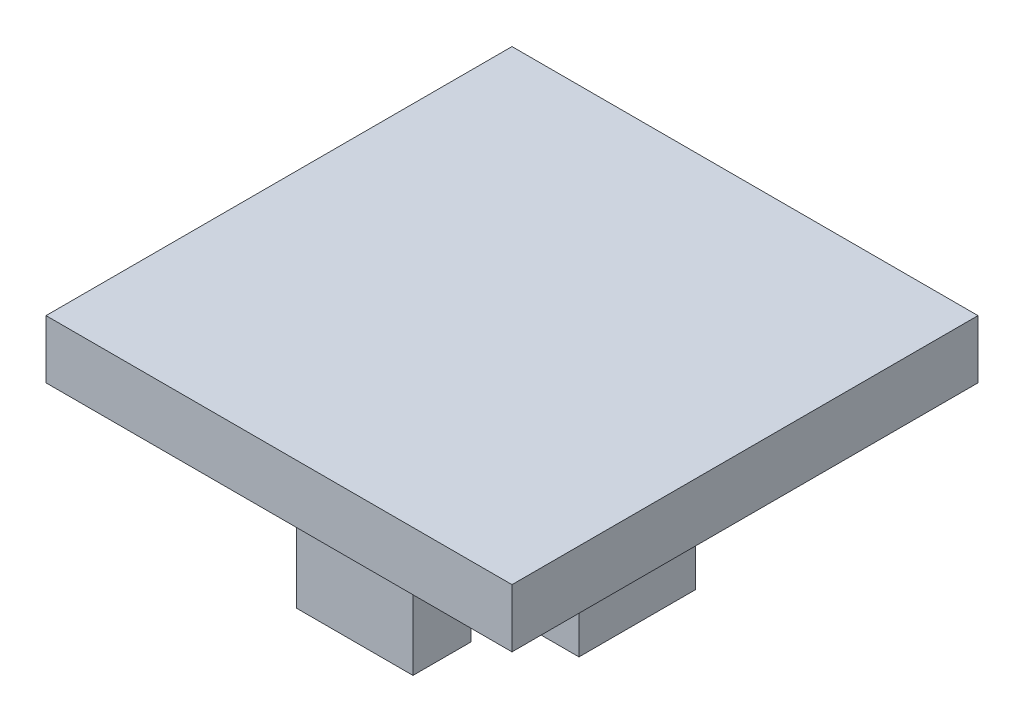
ISO-10303-21;
HEADER;
FILE_DESCRIPTION(('STEP AP214'),'2;1');
FILE_NAME('part.step','',(''),(''),'','','');
FILE_SCHEMA(('AUTOMOTIVE_DESIGN { 1 0 10303 214 1 1 1 1 }'));
ENDSEC;
DATA;
#1=APPLICATION_CONTEXT('core data for automotive mechanical design processes');
#2=APPLICATION_PROTOCOL_DEFINITION('international standard','automotive_design',2000,#1);
#3=PRODUCT_CONTEXT('',#1,'mechanical');
#4=PRODUCT('Part','Part','',(#3));
#5=PRODUCT_RELATED_PRODUCT_CATEGORY('part','',(#4));
#6=PRODUCT_DEFINITION_FORMATION('','',#4);
#7=PRODUCT_DEFINITION_CONTEXT('part definition',#1,'design');
#8=PRODUCT_DEFINITION('design','',#6,#7);
#9=PRODUCT_DEFINITION_SHAPE('','',#8);
#10=(LENGTH_UNIT() NAMED_UNIT(*) SI_UNIT(.MILLI.,.METRE.));
#11=(NAMED_UNIT(*) PLANE_ANGLE_UNIT() SI_UNIT($,.RADIAN.));
#12=(NAMED_UNIT(*) SI_UNIT($,.STERADIAN.) SOLID_ANGLE_UNIT());
#13=UNCERTAINTY_MEASURE_WITH_UNIT(LENGTH_MEASURE(1.E-05),#10,'distance_accuracy_value','');
#14=(GEOMETRIC_REPRESENTATION_CONTEXT(3) GLOBAL_UNCERTAINTY_ASSIGNED_CONTEXT((#13)) GLOBAL_UNIT_ASSIGNED_CONTEXT((#10,
#11,#12)) REPRESENTATION_CONTEXT('',''));
#15=CARTESIAN_POINT('',(0.,0.,0.));
#16=DIRECTION('',(0.,0.,1.));
#17=DIRECTION('',(1.,0.,0.));
#18=AXIS2_PLACEMENT_3D('',#15,#16,#17);
#19=CARTESIAN_POINT('',(-1.,-2.5,-1.7));
#20=DIRECTION('',(0.,0.,1.));
#21=DIRECTION('',(1.,0.,0.));
#22=AXIS2_PLACEMENT_3D('',#19,#20,#21);
#23=PLANE('',#22);
#24=DIRECTION('',(-1.,0.,0.));
#25=VECTOR('',#24,1.);
#26=CARTESIAN_POINT('',(-1.,-2.,-1.7));
#27=LINE('',#26,#25);
#28=CARTESIAN_POINT('',(1.,-2.,-1.7));
#29=VERTEX_POINT('',#28);
#30=CARTESIAN_POINT('',(-1.,-2.,-1.7));
#31=VERTEX_POINT('',#30);
#32=EDGE_CURVE('E284',#29,#31,#27,.T.);
#33=ORIENTED_EDGE('',*,*,#32,.T.);
#34=DIRECTION('',(0.,1.,0.));
#35=VECTOR('',#34,1.);
#36=CARTESIAN_POINT('',(-1.,-2.5,-1.7));
#37=LINE('',#36,#35);
#38=CARTESIAN_POINT('',(-1.,-2.5,-1.7));
#39=VERTEX_POINT('',#38);
#40=EDGE_CURVE('E317',#39,#31,#37,.T.);
#41=ORIENTED_EDGE('',*,*,#40,.F.);
#42=DIRECTION('',(1.,0.,0.));
#43=VECTOR('',#42,1.);
#44=CARTESIAN_POINT('',(-1.,-2.5,-1.7));
#45=LINE('',#44,#43);
#46=CARTESIAN_POINT('',(1.,-2.5,-1.7));
#47=VERTEX_POINT('',#46);
#48=EDGE_CURVE('E296',#39,#47,#45,.T.);
#49=ORIENTED_EDGE('',*,*,#48,.T.);
#50=DIRECTION('',(0.,1.,0.));
#51=VECTOR('',#50,1.);
#52=CARTESIAN_POINT('',(1.,-2.5,-1.7));
#53=LINE('',#52,#51);
#54=EDGE_CURVE('E320',#47,#29,#53,.T.);
#55=ORIENTED_EDGE('',*,*,#54,.T.);
#56=EDGE_LOOP('',(#33,#41,#49,#55));
#57=FACE_BOUND('',#56,.T.);
#58=ADVANCED_FACE('F35',(#57),#23,.T.);
#59=CARTESIAN_POINT('',(-1.,-2.5,1.7));
#60=DIRECTION('',(0.,0.,1.));
#61=DIRECTION('',(1.,0.,0.));
#62=AXIS2_PLACEMENT_3D('',#59,#60,#61);
#63=PLANE('',#62);
#64=DIRECTION('',(1.,0.,0.));
#65=VECTOR('',#64,1.);
#66=CARTESIAN_POINT('',(-1.,-1.5,1.7));
#67=LINE('',#66,#65);
#68=CARTESIAN_POINT('',(-1.,-1.5,1.7));
#69=VERTEX_POINT('',#68);
#70=CARTESIAN_POINT('',(1.,-1.5,1.7));
#71=VERTEX_POINT('',#70);
#72=EDGE_CURVE('E353',#69,#71,#67,.T.);
#73=ORIENTED_EDGE('',*,*,#72,.F.);
#74=DIRECTION('',(0.,1.,0.));
#75=VECTOR('',#74,1.);
#76=CARTESIAN_POINT('',(-1.,-2.5,1.7));
#77=LINE('',#76,#75);
#78=CARTESIAN_POINT('',(-1.,0.,1.7));
#79=VERTEX_POINT('',#78);
#80=EDGE_CURVE('E424',#69,#79,#77,.T.);
#81=ORIENTED_EDGE('',*,*,#80,.T.);
#82=DIRECTION('',(1.,0.,0.));
#83=VECTOR('',#82,1.);
#84=CARTESIAN_POINT('',(-1.,0.,1.7));
#85=LINE('',#84,#83);
#86=CARTESIAN_POINT('',(1.,0.,1.7));
#87=VERTEX_POINT('',#86);
#88=EDGE_CURVE('E408',#79,#87,#85,.T.);
#89=ORIENTED_EDGE('',*,*,#88,.T.);
#90=DIRECTION('',(0.,1.,0.));
#91=VECTOR('',#90,1.);
#92=CARTESIAN_POINT('',(1.,-2.5,1.7));
#93=LINE('',#92,#91);
#94=EDGE_CURVE('E414',#71,#87,#93,.T.);
#95=ORIENTED_EDGE('',*,*,#94,.F.);
#96=EDGE_LOOP('',(#73,#81,#89,#95));
#97=FACE_BOUND('',#96,.T.);
#98=ADVANCED_FACE('F554',(#97),#63,.F.);
#99=DIRECTION('',(-1.,0.,0.));
#100=VECTOR('',#99,1.);
#101=CARTESIAN_POINT('',(-1.,-2.,1.7));
#102=LINE('',#101,#100);
#103=CARTESIAN_POINT('',(1.,-2.,1.7));
#104=VERTEX_POINT('',#103);
#105=CARTESIAN_POINT('',(-1.,-2.,1.7));
#106=VERTEX_POINT('',#105);
#107=EDGE_CURVE('E357',#104,#106,#102,.T.);
#108=ORIENTED_EDGE('',*,*,#107,.F.);
#109=CARTESIAN_POINT('',(1.,-2.5,1.7));
#110=VERTEX_POINT('',#109);
#111=EDGE_CURVE('E421',#110,#104,#93,.T.);
#112=ORIENTED_EDGE('',*,*,#111,.F.);
#113=DIRECTION('',(1.,0.,0.));
#114=VECTOR('',#113,1.);
#115=CARTESIAN_POINT('',(-1.,-2.5,1.7));
#116=LINE('',#115,#114);
#117=CARTESIAN_POINT('',(-1.,-2.5,1.7));
#118=VERTEX_POINT('',#117);
#119=EDGE_CURVE('E412',#118,#110,#116,.T.);
#120=ORIENTED_EDGE('',*,*,#119,.F.);
#121=EDGE_CURVE('E425',#118,#106,#77,.T.);
#122=ORIENTED_EDGE('',*,*,#121,.T.);
#123=EDGE_LOOP('',(#108,#112,#120,#122));
#124=FACE_BOUND('',#123,.T.);
#125=ADVANCED_FACE('F544',(#124),#63,.F.);
#126=CARTESIAN_POINT('',(0.,0.,0.));
#127=DIRECTION('',(0.,-1.,0.));
#128=DIRECTION('',(0.,0.,-1.));
#129=AXIS2_PLACEMENT_3D('',#126,#127,#128);
#130=PLANE('',#129);
#131=DIRECTION('',(-1.,0.,0.));
#132=VECTOR('',#131,1.);
#133=CARTESIAN_POINT('',(-1.,0.,-3.7));
#134=LINE('',#133,#132);
#135=CARTESIAN_POINT('',(1.,0.,-3.7));
#136=VERTEX_POINT('',#135);
#137=CARTESIAN_POINT('',(-1.,0.,-3.7));
#138=VERTEX_POINT('',#137);
#139=EDGE_CURVE('E484',#136,#138,#134,.T.);
#140=ORIENTED_EDGE('',*,*,#139,.T.);
#141=DIRECTION('',(0.,0.,1.));
#142=VECTOR('',#141,1.);
#143=CARTESIAN_POINT('',(-1.,0.,-1.7));
#144=LINE('',#143,#142);
#145=CARTESIAN_POINT('',(-1.,0.,-1.7));
#146=VERTEX_POINT('',#145);
#147=EDGE_CURVE('E297',#138,#146,#144,.T.);
#148=ORIENTED_EDGE('',*,*,#147,.T.);
#149=DIRECTION('',(1.,0.,0.));
#150=VECTOR('',#149,1.);
#151=CARTESIAN_POINT('',(-1.,0.,-1.7));
#152=LINE('',#151,#150);
#153=CARTESIAN_POINT('',(1.,0.,-1.7));
#154=VERTEX_POINT('',#153);
#155=EDGE_CURVE('E308',#146,#154,#152,.T.);
#156=ORIENTED_EDGE('',*,*,#155,.T.);
#157=DIRECTION('',(0.,0.,-1.));
#158=VECTOR('',#157,1.);
#159=CARTESIAN_POINT('',(1.,0.,-1.7));
#160=LINE('',#159,#158);
#161=EDGE_CURVE('E292',#154,#136,#160,.T.);
#162=ORIENTED_EDGE('',*,*,#161,.T.);
#163=EDGE_LOOP('',(#140,#148,#156,#162));
#164=FACE_BOUND('',#163,.T.);
#165=DIRECTION('',(0.,0.,1.));
#166=VECTOR('',#165,1.);
#167=CARTESIAN_POINT('',(-3.15,0.,1.));
#168=LINE('',#167,#166);
#169=CARTESIAN_POINT('',(-3.15,0.,-1.));
#170=VERTEX_POINT('',#169);
#171=CARTESIAN_POINT('',(-3.15,0.,1.));
#172=VERTEX_POINT('',#171);
#173=EDGE_CURVE('E490',#170,#172,#168,.T.);
#174=ORIENTED_EDGE('',*,*,#173,.T.);
#175=DIRECTION('',(1.,0.,0.));
#176=VECTOR('',#175,1.);
#177=CARTESIAN_POINT('',(-1.15,0.,1.));
#178=LINE('',#177,#176);
#179=CARTESIAN_POINT('',(-1.15,0.,1.));
#180=VERTEX_POINT('',#179);
#181=EDGE_CURVE('E328',#172,#180,#178,.T.);
#182=ORIENTED_EDGE('',*,*,#181,.T.);
#183=DIRECTION('',(0.,0.,-1.));
#184=VECTOR('',#183,1.);
#185=CARTESIAN_POINT('',(-1.15,0.,1.));
#186=LINE('',#185,#184);
#187=CARTESIAN_POINT('',(-1.15,0.,-1.));
#188=VERTEX_POINT('',#187);
#189=EDGE_CURVE('E339',#180,#188,#186,.T.);
#190=ORIENTED_EDGE('',*,*,#189,.T.);
#191=DIRECTION('',(-1.,0.,0.));
#192=VECTOR('',#191,1.);
#193=CARTESIAN_POINT('',(-1.15,0.,-1.));
#194=LINE('',#193,#192);
#195=EDGE_CURVE('E323',#188,#170,#194,.T.);
#196=ORIENTED_EDGE('',*,*,#195,.T.);
#197=EDGE_LOOP('',(#174,#182,#190,#196));
#198=FACE_BOUND('',#197,.T.);
#199=DIRECTION('',(0.,0.,-1.));
#200=VECTOR('',#199,1.);
#201=CARTESIAN_POINT('',(4.,0.,4.));
#202=LINE('',#201,#200);
#203=CARTESIAN_POINT('',(4.,0.,4.));
#204=VERTEX_POINT('',#203);
#205=CARTESIAN_POINT('',(4.,0.,-4.));
#206=VERTEX_POINT('',#205);
#207=EDGE_CURVE('E434',#204,#206,#202,.T.);
#208=ORIENTED_EDGE('',*,*,#207,.F.);
#209=DIRECTION('',(1.,0.,0.));
#210=VECTOR('',#209,1.);
#211=CARTESIAN_POINT('',(-4.,0.,4.));
#212=LINE('',#211,#210);
#213=CARTESIAN_POINT('',(-4.,0.,4.));
#214=VERTEX_POINT('',#213);
#215=EDGE_CURVE('E439',#214,#204,#212,.T.);
#216=ORIENTED_EDGE('',*,*,#215,.F.);
#217=DIRECTION('',(0.,0.,1.));
#218=VECTOR('',#217,1.);
#219=CARTESIAN_POINT('',(-4.,0.,4.));
#220=LINE('',#219,#218);
#221=CARTESIAN_POINT('',(-4.,0.,-4.));
#222=VERTEX_POINT('',#221);
#223=EDGE_CURVE('E450',#222,#214,#220,.T.);
#224=ORIENTED_EDGE('',*,*,#223,.F.);
#225=DIRECTION('',(-1.,0.,0.));
#226=VECTOR('',#225,1.);
#227=CARTESIAN_POINT('',(-4.,0.,-4.));
#228=LINE('',#227,#226);
#229=EDGE_CURVE('E448',#206,#222,#228,.T.);
#230=ORIENTED_EDGE('',*,*,#229,.F.);
#231=EDGE_LOOP('',(#208,#216,#224,#230));
#232=FACE_BOUND('',#231,.T.);
#233=DIRECTION('',(0.,0.,-1.));
#234=VECTOR('',#233,1.);
#235=CARTESIAN_POINT('',(-1.,0.,1.7));
#236=LINE('',#235,#234);
#237=CARTESIAN_POINT('',(-1.,0.,3.7));
#238=VERTEX_POINT('',#237);
#239=EDGE_CURVE('E416',#238,#79,#236,.T.);
#240=ORIENTED_EDGE('',*,*,#239,.F.);
#241=DIRECTION('',(-1.,0.,0.));
#242=VECTOR('',#241,1.);
#243=CARTESIAN_POINT('',(0.,0.,3.7));
#244=LINE('',#243,#242);
#245=CARTESIAN_POINT('',(1.,0.,3.7));
#246=VERTEX_POINT('',#245);
#247=EDGE_CURVE('E493',#238,#246,#244,.F.);
#248=ORIENTED_EDGE('',*,*,#247,.T.);
#249=DIRECTION('',(0.,0.,1.));
#250=VECTOR('',#249,1.);
#251=CARTESIAN_POINT('',(1.,0.,1.7));
#252=LINE('',#251,#250);
#253=EDGE_CURVE('E403',#87,#246,#252,.T.);
#254=ORIENTED_EDGE('',*,*,#253,.F.);
#255=ORIENTED_EDGE('',*,*,#88,.F.);
#256=EDGE_LOOP('',(#240,#248,#254,#255));
#257=FACE_BOUND('',#256,.T.);
#258=DIRECTION('',(-1.,0.,0.));
#259=VECTOR('',#258,1.);
#260=CARTESIAN_POINT('',(1.15,0.,1.));
#261=LINE('',#260,#259);
#262=CARTESIAN_POINT('',(3.15,0.,1.));
#263=VERTEX_POINT('',#262);
#264=CARTESIAN_POINT('',(1.15,0.,1.));
#265=VERTEX_POINT('',#264);
#266=EDGE_CURVE('E376',#263,#265,#261,.T.);
#267=ORIENTED_EDGE('',*,*,#266,.F.);
#268=DIRECTION('',(0.,0.,1.));
#269=VECTOR('',#268,1.);
#270=CARTESIAN_POINT('',(3.15,0.,0.));
#271=LINE('',#270,#269);
#272=CARTESIAN_POINT('',(3.15,0.,-1.));
#273=VERTEX_POINT('',#272);
#274=EDGE_CURVE('E487',#263,#273,#271,.F.);
#275=ORIENTED_EDGE('',*,*,#274,.T.);
#276=DIRECTION('',(1.,0.,0.));
#277=VECTOR('',#276,1.);
#278=CARTESIAN_POINT('',(1.15,0.,-1.));
#279=LINE('',#278,#277);
#280=CARTESIAN_POINT('',(1.15,0.,-1.));
#281=VERTEX_POINT('',#280);
#282=EDGE_CURVE('E381',#281,#273,#279,.T.);
#283=ORIENTED_EDGE('',*,*,#282,.F.);
#284=DIRECTION('',(0.,0.,-1.));
#285=VECTOR('',#284,1.);
#286=CARTESIAN_POINT('',(1.15,0.,1.));
#287=LINE('',#286,#285);
#288=EDGE_CURVE('E389',#265,#281,#287,.T.);
#289=ORIENTED_EDGE('',*,*,#288,.F.);
#290=EDGE_LOOP('',(#267,#275,#283,#289));
#291=FACE_BOUND('',#290,.T.);
#292=ADVANCED_FACE('F541',(#164,#198,#232,#257,#291),#130,.T.);
#293=CARTESIAN_POINT('',(4.,1.,4.));
#294=DIRECTION('',(-1.,0.,0.));
#295=DIRECTION('',(0.,0.,1.));
#296=AXIS2_PLACEMENT_3D('',#293,#294,#295);
#297=PLANE('',#296);
#298=ORIENTED_EDGE('',*,*,#207,.T.);
#299=DIRECTION('',(0.,-1.,0.));
#300=VECTOR('',#299,1.);
#301=CARTESIAN_POINT('',(4.,1.,-4.));
#302=LINE('',#301,#300);
#303=CARTESIAN_POINT('',(4.,1.,-4.));
#304=VERTEX_POINT('',#303);
#305=EDGE_CURVE('E461',#304,#206,#302,.T.);
#306=ORIENTED_EDGE('',*,*,#305,.F.);
#307=DIRECTION('',(0.,0.,-1.));
#308=VECTOR('',#307,1.);
#309=CARTESIAN_POINT('',(4.,1.,4.));
#310=LINE('',#309,#308);
#311=CARTESIAN_POINT('',(4.,1.,4.));
#312=VERTEX_POINT('',#311);
#313=EDGE_CURVE('E435',#312,#304,#310,.T.);
#314=ORIENTED_EDGE('',*,*,#313,.F.);
#315=DIRECTION('',(0.,-1.,0.));
#316=VECTOR('',#315,1.);
#317=CARTESIAN_POINT('',(4.,1.,4.));
#318=LINE('',#317,#316);
#319=EDGE_CURVE('E445',#312,#204,#318,.T.);
#320=ORIENTED_EDGE('',*,*,#319,.T.);
#321=EDGE_LOOP('',(#298,#306,#314,#320));
#322=FACE_BOUND('',#321,.T.);
#323=ADVANCED_FACE('F543',(#322),#297,.F.);
#324=CARTESIAN_POINT('',(-4.,1.,-4.));
#325=DIRECTION('',(0.,0.,1.));
#326=DIRECTION('',(1.,0.,0.));
#327=AXIS2_PLACEMENT_3D('',#324,#325,#326);
#328=PLANE('',#327);
#329=ORIENTED_EDGE('',*,*,#229,.T.);
#330=DIRECTION('',(0.,-1.,0.));
#331=VECTOR('',#330,1.);
#332=CARTESIAN_POINT('',(-4.,1.,-4.));
#333=LINE('',#332,#331);
#334=CARTESIAN_POINT('',(-4.,1.,-4.));
#335=VERTEX_POINT('',#334);
#336=EDGE_CURVE('E458',#335,#222,#333,.T.);
#337=ORIENTED_EDGE('',*,*,#336,.F.);
#338=DIRECTION('',(-1.,0.,0.));
#339=VECTOR('',#338,1.);
#340=CARTESIAN_POINT('',(-4.,1.,-4.));
#341=LINE('',#340,#339);
#342=EDGE_CURVE('E438',#304,#335,#341,.T.);
#343=ORIENTED_EDGE('',*,*,#342,.F.);
#344=ORIENTED_EDGE('',*,*,#305,.T.);
#345=EDGE_LOOP('',(#329,#337,#343,#344));
#346=FACE_BOUND('',#345,.T.);
#347=ADVANCED_FACE('F551',(#346),#328,.F.);
#348=CARTESIAN_POINT('',(-4.,1.,4.));
#349=DIRECTION('',(1.,0.,0.));
#350=DIRECTION('',(0.,0.,-1.));
#351=AXIS2_PLACEMENT_3D('',#348,#349,#350);
#352=PLANE('',#351);
#353=ORIENTED_EDGE('',*,*,#223,.T.);
#354=DIRECTION('',(0.,-1.,0.));
#355=VECTOR('',#354,1.);
#356=CARTESIAN_POINT('',(-4.,1.,4.));
#357=LINE('',#356,#355);
#358=CARTESIAN_POINT('',(-4.,1.,4.));
#359=VERTEX_POINT('',#358);
#360=EDGE_CURVE('E455',#359,#214,#357,.T.);
#361=ORIENTED_EDGE('',*,*,#360,.F.);
#362=DIRECTION('',(0.,0.,1.));
#363=VECTOR('',#362,1.);
#364=CARTESIAN_POINT('',(-4.,1.,4.));
#365=LINE('',#364,#363);
#366=EDGE_CURVE('E441',#335,#359,#365,.T.);
#367=ORIENTED_EDGE('',*,*,#366,.F.);
#368=ORIENTED_EDGE('',*,*,#336,.T.);
#369=EDGE_LOOP('',(#353,#361,#367,#368));
#370=FACE_BOUND('',#369,.T.);
#371=ADVANCED_FACE('F629',(#370),#352,.F.);
#372=CARTESIAN_POINT('',(-4.,1.,4.));
#373=DIRECTION('',(0.,0.,-1.));
#374=DIRECTION('',(-1.,0.,0.));
#375=AXIS2_PLACEMENT_3D('',#372,#373,#374);
#376=PLANE('',#375);
#377=ORIENTED_EDGE('',*,*,#215,.T.);
#378=ORIENTED_EDGE('',*,*,#319,.F.);
#379=DIRECTION('',(1.,0.,0.));
#380=VECTOR('',#379,1.);
#381=CARTESIAN_POINT('',(-4.,1.,4.));
#382=LINE('',#381,#380);
#383=EDGE_CURVE('E443',#359,#312,#382,.T.);
#384=ORIENTED_EDGE('',*,*,#383,.F.);
#385=ORIENTED_EDGE('',*,*,#360,.T.);
#386=EDGE_LOOP('',(#377,#378,#384,#385));
#387=FACE_BOUND('',#386,.T.);
#388=ADVANCED_FACE('F632',(#387),#376,.F.);
#389=CARTESIAN_POINT('',(0.,1.,0.));
#390=DIRECTION('',(0.,-1.,0.));
#391=DIRECTION('',(0.,0.,-1.));
#392=AXIS2_PLACEMENT_3D('',#389,#390,#391);
#393=PLANE('',#392);
#394=ORIENTED_EDGE('',*,*,#313,.T.);
#395=ORIENTED_EDGE('',*,*,#342,.T.);
#396=ORIENTED_EDGE('',*,*,#366,.T.);
#397=ORIENTED_EDGE('',*,*,#383,.T.);
#398=EDGE_LOOP('',(#394,#395,#396,#397));
#399=FACE_BOUND('',#398,.T.);
#400=ADVANCED_FACE('F635',(#399),#393,.F.);
#401=CARTESIAN_POINT('',(1.,-2.5,1.7));
#402=DIRECTION('',(-1.,0.,0.));
#403=DIRECTION('',(0.,0.,1.));
#404=AXIS2_PLACEMENT_3D('',#401,#402,#403);
#405=PLANE('',#404);
#406=DIRECTION('',(0.,0.,1.));
#407=VECTOR('',#406,1.);
#408=CARTESIAN_POINT('',(1.,-1.5,1.2));
#409=LINE('',#408,#407);
#410=CARTESIAN_POINT('',(1.,-1.5,1.2));
#411=VERTEX_POINT('',#410);
#412=EDGE_CURVE('E370',#411,#71,#409,.T.);
#413=ORIENTED_EDGE('',*,*,#412,.T.);
#414=ORIENTED_EDGE('',*,*,#94,.T.);
#415=ORIENTED_EDGE('',*,*,#253,.T.);
#416=CARTESIAN_POINT('',(1.,-1.,3.7));
#417=DIRECTION('',(-1.,0.,0.));
#418=DIRECTION('',(0.,0.,1.));
#419=AXIS2_PLACEMENT_3D('',#416,#417,#418);
#420=CIRCLE('',#419,1.);
#421=CARTESIAN_POINT('',(1.,-1.,2.7));
#422=VERTEX_POINT('',#421);
#423=EDGE_CURVE('E505',#246,#422,#420,.T.);
#424=ORIENTED_EDGE('',*,*,#423,.T.);
#425=DIRECTION('',(0.,1.,0.));
#426=VECTOR('',#425,1.);
#427=CARTESIAN_POINT('',(1.,-2.5,2.7));
#428=LINE('',#427,#426);
#429=CARTESIAN_POINT('',(1.,-2.5,2.7));
#430=VERTEX_POINT('',#429);
#431=EDGE_CURVE('E431',#430,#422,#428,.T.);
#432=ORIENTED_EDGE('',*,*,#431,.F.);
#433=DIRECTION('',(0.,0.,1.));
#434=VECTOR('',#433,1.);
#435=CARTESIAN_POINT('',(1.,-2.5,1.7));
#436=LINE('',#435,#434);
#437=EDGE_CURVE('E404',#110,#430,#436,.T.);
#438=ORIENTED_EDGE('',*,*,#437,.F.);
#439=ORIENTED_EDGE('',*,*,#111,.T.);
#440=DIRECTION('',(0.,0.,1.));
#441=VECTOR('',#440,1.);
#442=CARTESIAN_POINT('',(1.,-2.,1.2));
#443=LINE('',#442,#441);
#444=CARTESIAN_POINT('',(1.,-2.,1.5));
#445=VERTEX_POINT('',#444);
#446=EDGE_CURVE('E368',#445,#104,#443,.T.);
#447=ORIENTED_EDGE('',*,*,#446,.F.);
#448=DIRECTION('',(0.,0.707106781186548,-0.707106781186548));
#449=VECTOR('',#448,1.);
#450=CARTESIAN_POINT('',(1.,-1.7,1.2));
#451=LINE('',#450,#449);
#452=CARTESIAN_POINT('',(1.,-1.7,1.2));
#453=VERTEX_POINT('',#452);
#454=EDGE_CURVE('E471',#445,#453,#451,.T.);
#455=ORIENTED_EDGE('',*,*,#454,.T.);
#456=DIRECTION('',(0.,-1.,0.));
#457=VECTOR('',#456,1.);
#458=CARTESIAN_POINT('',(1.,-2.,1.2));
#459=LINE('',#458,#457);
#460=EDGE_CURVE('E359',#411,#453,#459,.T.);
#461=ORIENTED_EDGE('',*,*,#460,.F.);
#462=EDGE_LOOP('',(#413,#414,#415,#424,#432,#438,#439,#447,#455,#461));
#463=FACE_BOUND('',#462,.T.);
#464=ADVANCED_FACE('F640',(#463),#405,.F.);
#465=CARTESIAN_POINT('',(-1.,-2.5,2.7));
#466=DIRECTION('',(0.,0.,-1.));
#467=DIRECTION('',(-1.,0.,0.));
#468=AXIS2_PLACEMENT_3D('',#465,#466,#467);
#469=PLANE('',#468);
#470=ORIENTED_EDGE('',*,*,#431,.T.);
#471=DIRECTION('',(-1.,0.,0.));
#472=VECTOR('',#471,1.);
#473=CARTESIAN_POINT('',(-1.,-1.,2.7));
#474=LINE('',#473,#472);
#475=CARTESIAN_POINT('',(-1.,-1.,2.7));
#476=VERTEX_POINT('',#475);
#477=EDGE_CURVE('E481',#422,#476,#474,.T.);
#478=ORIENTED_EDGE('',*,*,#477,.T.);
#479=DIRECTION('',(0.,1.,0.));
#480=VECTOR('',#479,1.);
#481=CARTESIAN_POINT('',(-1.,-2.5,2.7));
#482=LINE('',#481,#480);
#483=CARTESIAN_POINT('',(-1.,-2.5,2.7));
#484=VERTEX_POINT('',#483);
#485=EDGE_CURVE('E428',#484,#476,#482,.T.);
#486=ORIENTED_EDGE('',*,*,#485,.F.);
#487=DIRECTION('',(-1.,0.,0.));
#488=VECTOR('',#487,1.);
#489=CARTESIAN_POINT('',(-1.,-2.5,2.7));
#490=LINE('',#489,#488);
#491=EDGE_CURVE('E407',#430,#484,#490,.T.);
#492=ORIENTED_EDGE('',*,*,#491,.F.);
#493=EDGE_LOOP('',(#470,#478,#486,#492));
#494=FACE_BOUND('',#493,.T.);
#495=ADVANCED_FACE('F668',(#494),#469,.F.);
#496=CARTESIAN_POINT('',(-1.,-2.5,1.7));
#497=DIRECTION('',(1.,0.,0.));
#498=DIRECTION('',(0.,0.,-1.));
#499=AXIS2_PLACEMENT_3D('',#496,#497,#498);
#500=PLANE('',#499);
#501=DIRECTION('',(0.,0.,1.));
#502=VECTOR('',#501,1.);
#503=CARTESIAN_POINT('',(-1.,-2.,1.2));
#504=LINE('',#503,#502);
#505=CARTESIAN_POINT('',(-1.,-2.,1.5));
#506=VERTEX_POINT('',#505);
#507=EDGE_CURVE('E362',#506,#106,#504,.T.);
#508=ORIENTED_EDGE('',*,*,#507,.T.);
#509=ORIENTED_EDGE('',*,*,#121,.F.);
#510=DIRECTION('',(0.,0.,-1.));
#511=VECTOR('',#510,1.);
#512=CARTESIAN_POINT('',(-1.,-2.5,1.7));
#513=LINE('',#512,#511);
#514=EDGE_CURVE('E410',#484,#118,#513,.T.);
#515=ORIENTED_EDGE('',*,*,#514,.F.);
#516=ORIENTED_EDGE('',*,*,#485,.T.);
#517=CARTESIAN_POINT('',(-1.,-1.,3.7));
#518=DIRECTION('',(1.,0.,0.));
#519=DIRECTION('',(0.,0.,-1.));
#520=AXIS2_PLACEMENT_3D('',#517,#518,#519);
#521=CIRCLE('',#520,1.);
#522=EDGE_CURVE('E502',#476,#238,#521,.T.);
#523=ORIENTED_EDGE('',*,*,#522,.T.);
#524=ORIENTED_EDGE('',*,*,#239,.T.);
#525=ORIENTED_EDGE('',*,*,#80,.F.);
#526=DIRECTION('',(0.,0.,1.));
#527=VECTOR('',#526,1.);
#528=CARTESIAN_POINT('',(-1.,-1.5,1.2));
#529=LINE('',#528,#527);
#530=CARTESIAN_POINT('',(-1.,-1.5,1.2));
#531=VERTEX_POINT('',#530);
#532=EDGE_CURVE('E373',#531,#69,#529,.T.);
#533=ORIENTED_EDGE('',*,*,#532,.F.);
#534=DIRECTION('',(0.,1.,0.));
#535=VECTOR('',#534,1.);
#536=CARTESIAN_POINT('',(-1.,-2.,1.2));
#537=LINE('',#536,#535);
#538=CARTESIAN_POINT('',(-1.,-1.7,1.2));
#539=VERTEX_POINT('',#538);
#540=EDGE_CURVE('E354',#539,#531,#537,.T.);
#541=ORIENTED_EDGE('',*,*,#540,.F.);
#542=DIRECTION('',(0.,-0.707106781186548,0.707106781186548));
#543=VECTOR('',#542,1.);
#544=CARTESIAN_POINT('',(-1.,-1.7,1.2));
#545=LINE('',#544,#543);
#546=EDGE_CURVE('E467',#539,#506,#545,.T.);
#547=ORIENTED_EDGE('',*,*,#546,.T.);
#548=EDGE_LOOP('',(#508,#509,#515,#516,#523,#524,#525,#533,#541,#547));
#549=FACE_BOUND('',#548,.T.);
#550=ADVANCED_FACE('F660',(#549),#500,.F.);
#551=CARTESIAN_POINT('',(0.,-2.5,0.));
#552=DIRECTION('',(0.,1.,0.));
#553=DIRECTION('',(0.,0.,1.));
#554=AXIS2_PLACEMENT_3D('',#551,#552,#553);
#555=PLANE('',#554);
#556=ORIENTED_EDGE('',*,*,#437,.T.);
#557=ORIENTED_EDGE('',*,*,#491,.T.);
#558=ORIENTED_EDGE('',*,*,#514,.T.);
#559=ORIENTED_EDGE('',*,*,#119,.T.);
#560=EDGE_LOOP('',(#556,#557,#558,#559));
#561=FACE_BOUND('',#560,.T.);
#562=ADVANCED_FACE('F670',(#561),#555,.F.);
#563=CARTESIAN_POINT('',(2.15,-2.5,1.));
#564=DIRECTION('',(-1.,0.,0.));
#565=DIRECTION('',(0.,0.,1.));
#566=AXIS2_PLACEMENT_3D('',#563,#564,#565);
#567=PLANE('',#566);
#568=DIRECTION('',(0.,1.,0.));
#569=VECTOR('',#568,1.);
#570=CARTESIAN_POINT('',(2.15,-2.5,-1.));
#571=LINE('',#570,#569);
#572=CARTESIAN_POINT('',(2.15,-2.5,-1.));
#573=VERTEX_POINT('',#572);
#574=CARTESIAN_POINT('',(2.15,-1.,-1.));
#575=VERTEX_POINT('',#574);
#576=EDGE_CURVE('E387',#573,#575,#571,.T.);
#577=ORIENTED_EDGE('',*,*,#576,.T.);
#578=DIRECTION('',(0.,0.,1.));
#579=VECTOR('',#578,1.);
#580=CARTESIAN_POINT('',(2.15,-1.,1.));
#581=LINE('',#580,#579);
#582=CARTESIAN_POINT('',(2.15,-1.,1.));
#583=VERTEX_POINT('',#582);
#584=EDGE_CURVE('E498',#575,#583,#581,.T.);
#585=ORIENTED_EDGE('',*,*,#584,.T.);
#586=DIRECTION('',(0.,1.,0.));
#587=VECTOR('',#586,1.);
#588=CARTESIAN_POINT('',(2.15,-2.5,1.));
#589=LINE('',#588,#587);
#590=CARTESIAN_POINT('',(2.15,-2.5,1.));
#591=VERTEX_POINT('',#590);
#592=EDGE_CURVE('E400',#591,#583,#589,.T.);
#593=ORIENTED_EDGE('',*,*,#592,.F.);
#594=DIRECTION('',(0.,0.,1.));
#595=VECTOR('',#594,1.);
#596=CARTESIAN_POINT('',(2.15,-2.5,1.));
#597=LINE('',#596,#595);
#598=EDGE_CURVE('E377',#573,#591,#597,.T.);
#599=ORIENTED_EDGE('',*,*,#598,.F.);
#600=EDGE_LOOP('',(#577,#585,#593,#599));
#601=FACE_BOUND('',#600,.T.);
#602=ADVANCED_FACE('F527',(#601),#567,.F.);
#603=CARTESIAN_POINT('',(1.15,-2.5,1.));
#604=DIRECTION('',(0.,0.,-1.));
#605=DIRECTION('',(-1.,0.,0.));
#606=AXIS2_PLACEMENT_3D('',#603,#604,#605);
#607=PLANE('',#606);
#608=ORIENTED_EDGE('',*,*,#266,.T.);
#609=DIRECTION('',(0.,1.,0.));
#610=VECTOR('',#609,1.);
#611=CARTESIAN_POINT('',(1.15,-2.5,1.));
#612=LINE('',#611,#610);
#613=CARTESIAN_POINT('',(1.15,-2.5,1.));
#614=VERTEX_POINT('',#613);
#615=EDGE_CURVE('E397',#614,#265,#612,.T.);
#616=ORIENTED_EDGE('',*,*,#615,.F.);
#617=DIRECTION('',(-1.,0.,0.));
#618=VECTOR('',#617,1.);
#619=CARTESIAN_POINT('',(1.15,-2.5,1.));
#620=LINE('',#619,#618);
#621=EDGE_CURVE('E380',#591,#614,#620,.T.);
#622=ORIENTED_EDGE('',*,*,#621,.F.);
#623=ORIENTED_EDGE('',*,*,#592,.T.);
#624=CARTESIAN_POINT('',(3.15,-1.,1.));
#625=DIRECTION('',(0.,0.,-1.));
#626=DIRECTION('',(-1.,0.,0.));
#627=AXIS2_PLACEMENT_3D('',#624,#625,#626);
#628=CIRCLE('',#627,1.);
#629=EDGE_CURVE('E512',#583,#263,#628,.T.);
#630=ORIENTED_EDGE('',*,*,#629,.T.);
#631=EDGE_LOOP('',(#608,#616,#622,#623,#630));
#632=FACE_BOUND('',#631,.T.);
#633=ADVANCED_FACE('F531',(#632),#607,.F.);
#634=CARTESIAN_POINT('',(1.15,-2.5,1.));
#635=DIRECTION('',(1.,0.,0.));
#636=DIRECTION('',(0.,0.,-1.));
#637=AXIS2_PLACEMENT_3D('',#634,#635,#636);
#638=PLANE('',#637);
#639=ORIENTED_EDGE('',*,*,#288,.T.);
#640=DIRECTION('',(0.,1.,0.));
#641=VECTOR('',#640,1.);
#642=CARTESIAN_POINT('',(1.15,-2.5,-1.));
#643=LINE('',#642,#641);
#644=CARTESIAN_POINT('',(1.15,-2.5,-1.));
#645=VERTEX_POINT('',#644);
#646=EDGE_CURVE('E395',#645,#281,#643,.T.);
#647=ORIENTED_EDGE('',*,*,#646,.F.);
#648=DIRECTION('',(0.,0.,-1.));
#649=VECTOR('',#648,1.);
#650=CARTESIAN_POINT('',(1.15,-2.5,1.));
#651=LINE('',#650,#649);
#652=EDGE_CURVE('E383',#614,#645,#651,.T.);
#653=ORIENTED_EDGE('',*,*,#652,.F.);
#654=ORIENTED_EDGE('',*,*,#615,.T.);
#655=EDGE_LOOP('',(#639,#647,#653,#654));
#656=FACE_BOUND('',#655,.T.);
#657=ADVANCED_FACE('F539',(#656),#638,.F.);
#658=CARTESIAN_POINT('',(1.15,-2.5,-1.));
#659=DIRECTION('',(0.,0.,1.));
#660=DIRECTION('',(1.,0.,0.));
#661=AXIS2_PLACEMENT_3D('',#658,#659,#660);
#662=PLANE('',#661);
#663=ORIENTED_EDGE('',*,*,#282,.T.);
#664=CARTESIAN_POINT('',(3.15,-1.,-1.));
#665=DIRECTION('',(0.,0.,1.));
#666=DIRECTION('',(1.,0.,0.));
#667=AXIS2_PLACEMENT_3D('',#664,#665,#666);
#668=CIRCLE('',#667,1.);
#669=EDGE_CURVE('E515',#273,#575,#668,.T.);
#670=ORIENTED_EDGE('',*,*,#669,.T.);
#671=ORIENTED_EDGE('',*,*,#576,.F.);
#672=DIRECTION('',(1.,0.,0.));
#673=VECTOR('',#672,1.);
#674=CARTESIAN_POINT('',(1.15,-2.5,-1.));
#675=LINE('',#674,#673);
#676=EDGE_CURVE('E385',#645,#573,#675,.T.);
#677=ORIENTED_EDGE('',*,*,#676,.F.);
#678=ORIENTED_EDGE('',*,*,#646,.T.);
#679=EDGE_LOOP('',(#663,#670,#671,#677,#678));
#680=FACE_BOUND('',#679,.T.);
#681=ADVANCED_FACE('F519',(#680),#662,.F.);
#682=CARTESIAN_POINT('',(0.,-2.5,0.));
#683=DIRECTION('',(0.,-1.,0.));
#684=DIRECTION('',(0.,0.,-1.));
#685=AXIS2_PLACEMENT_3D('',#682,#683,#684);
#686=PLANE('',#685);
#687=ORIENTED_EDGE('',*,*,#598,.T.);
#688=ORIENTED_EDGE('',*,*,#621,.T.);
#689=ORIENTED_EDGE('',*,*,#652,.T.);
#690=ORIENTED_EDGE('',*,*,#676,.T.);
#691=EDGE_LOOP('',(#687,#688,#689,#690));
#692=FACE_BOUND('',#691,.T.);
#693=ADVANCED_FACE('F535',(#692),#686,.T.);
#694=CARTESIAN_POINT('',(-1.,-1.5,1.2));
#695=DIRECTION('',(0.,-1.,0.));
#696=DIRECTION('',(1.,0.,0.));
#697=AXIS2_PLACEMENT_3D('',#694,#695,#696);
#698=PLANE('',#697);
#699=ORIENTED_EDGE('',*,*,#72,.T.);
#700=ORIENTED_EDGE('',*,*,#412,.F.);
#701=DIRECTION('',(1.,0.,0.));
#702=VECTOR('',#701,1.);
#703=CARTESIAN_POINT('',(-1.,-1.5,1.2));
#704=LINE('',#703,#702);
#705=EDGE_CURVE('E356',#531,#411,#704,.T.);
#706=ORIENTED_EDGE('',*,*,#705,.F.);
#707=ORIENTED_EDGE('',*,*,#532,.T.);
#708=EDGE_LOOP('',(#699,#700,#706,#707));
#709=FACE_BOUND('',#708,.T.);
#710=ADVANCED_FACE('F689',(#709),#698,.F.);
#711=CARTESIAN_POINT('',(-1.,-2.,1.2));
#712=DIRECTION('',(0.,1.,0.));
#713=DIRECTION('',(-1.,0.,0.));
#714=AXIS2_PLACEMENT_3D('',#711,#712,#713);
#715=PLANE('',#714);
#716=ORIENTED_EDGE('',*,*,#507,.F.);
#717=DIRECTION('',(1.,0.,0.));
#718=VECTOR('',#717,1.);
#719=CARTESIAN_POINT('',(1.,-2.,1.5));
#720=LINE('',#719,#718);
#721=EDGE_CURVE('E469',#506,#445,#720,.T.);
#722=ORIENTED_EDGE('',*,*,#721,.T.);
#723=ORIENTED_EDGE('',*,*,#446,.T.);
#724=ORIENTED_EDGE('',*,*,#107,.T.);
#725=EDGE_LOOP('',(#716,#722,#723,#724));
#726=FACE_BOUND('',#725,.T.);
#727=ADVANCED_FACE('F679',(#726),#715,.F.);
#728=CARTESIAN_POINT('',(0.,0.,1.2));
#729=DIRECTION('',(0.,0.,-1.));
#730=DIRECTION('',(-1.,0.,0.));
#731=AXIS2_PLACEMENT_3D('',#728,#729,#730);
#732=PLANE('',#731);
#733=ORIENTED_EDGE('',*,*,#460,.T.);
#734=DIRECTION('',(-1.,0.,0.));
#735=VECTOR('',#734,1.);
#736=CARTESIAN_POINT('',(-1.,-1.7,1.2));
#737=LINE('',#736,#735);
#738=EDGE_CURVE('E464',#453,#539,#737,.T.);
#739=ORIENTED_EDGE('',*,*,#738,.T.);
#740=ORIENTED_EDGE('',*,*,#540,.T.);
#741=ORIENTED_EDGE('',*,*,#705,.T.);
#742=EDGE_LOOP('',(#733,#739,#740,#741));
#743=FACE_BOUND('',#742,.T.);
#744=ADVANCED_FACE('F624',(#743),#732,.T.);
#745=CARTESIAN_POINT('',(0.,-1.7,1.2));
#746=DIRECTION('',(0.,-0.707106781186547,-0.707106781186547));
#747=DIRECTION('',(1.,0.,0.));
#748=AXIS2_PLACEMENT_3D('',#745,#746,#747);
#749=PLANE('',#748);
#750=ORIENTED_EDGE('',*,*,#454,.F.);
#751=ORIENTED_EDGE('',*,*,#721,.F.);
#752=ORIENTED_EDGE('',*,*,#546,.F.);
#753=ORIENTED_EDGE('',*,*,#738,.F.);
#754=EDGE_LOOP('',(#750,#751,#752,#753));
#755=FACE_BOUND('',#754,.T.);
#756=ADVANCED_FACE('F619',(#755),#749,.T.);
#757=CARTESIAN_POINT('',(-2.15,-2.5,1.));
#758=DIRECTION('',(-1.,0.,0.));
#759=DIRECTION('',(0.,0.,1.));
#760=AXIS2_PLACEMENT_3D('',#757,#758,#759);
#761=PLANE('',#760);
#762=DIRECTION('',(0.,1.,0.));
#763=VECTOR('',#762,1.);
#764=CARTESIAN_POINT('',(-2.15,-2.5,1.));
#765=LINE('',#764,#763);
#766=CARTESIAN_POINT('',(-2.15,-2.5,1.));
#767=VERTEX_POINT('',#766);
#768=CARTESIAN_POINT('',(-2.15,-1.,1.));
#769=VERTEX_POINT('',#768);
#770=EDGE_CURVE('E337',#767,#769,#765,.T.);
#771=ORIENTED_EDGE('',*,*,#770,.T.);
#772=DIRECTION('',(0.,0.,1.));
#773=VECTOR('',#772,1.);
#774=CARTESIAN_POINT('',(-2.15,-1.,-1.));
#775=LINE('',#774,#773);
#776=CARTESIAN_POINT('',(-2.15,-1.,-1.));
#777=VERTEX_POINT('',#776);
#778=EDGE_CURVE('E496',#769,#777,#775,.F.);
#779=ORIENTED_EDGE('',*,*,#778,.T.);
#780=DIRECTION('',(0.,1.,0.));
#781=VECTOR('',#780,1.);
#782=CARTESIAN_POINT('',(-2.15,-2.5,-1.));
#783=LINE('',#782,#781);
#784=CARTESIAN_POINT('',(-2.15,-2.5,-1.));
#785=VERTEX_POINT('',#784);
#786=EDGE_CURVE('E350',#785,#777,#783,.T.);
#787=ORIENTED_EDGE('',*,*,#786,.F.);
#788=DIRECTION('',(0.,0.,1.));
#789=VECTOR('',#788,1.);
#790=CARTESIAN_POINT('',(-2.15,-2.5,1.));
#791=LINE('',#790,#789);
#792=EDGE_CURVE('E324',#785,#767,#791,.T.);
#793=ORIENTED_EDGE('',*,*,#792,.T.);
#794=EDGE_LOOP('',(#771,#779,#787,#793));
#795=FACE_BOUND('',#794,.T.);
#796=ADVANCED_FACE('F623',(#795),#761,.T.);
#797=CARTESIAN_POINT('',(-1.15,-2.5,-1.));
#798=DIRECTION('',(0.,0.,-1.));
#799=DIRECTION('',(-1.,0.,0.));
#800=AXIS2_PLACEMENT_3D('',#797,#798,#799);
#801=PLANE('',#800);
#802=ORIENTED_EDGE('',*,*,#195,.F.);
#803=DIRECTION('',(0.,1.,0.));
#804=VECTOR('',#803,1.);
#805=CARTESIAN_POINT('',(-1.15,-2.5,-1.));
#806=LINE('',#805,#804);
#807=CARTESIAN_POINT('',(-1.15,-2.5,-1.));
#808=VERTEX_POINT('',#807);
#809=EDGE_CURVE('E347',#808,#188,#806,.T.);
#810=ORIENTED_EDGE('',*,*,#809,.F.);
#811=DIRECTION('',(-1.,0.,0.));
#812=VECTOR('',#811,1.);
#813=CARTESIAN_POINT('',(-1.15,-2.5,-1.));
#814=LINE('',#813,#812);
#815=EDGE_CURVE('E327',#808,#785,#814,.T.);
#816=ORIENTED_EDGE('',*,*,#815,.T.);
#817=ORIENTED_EDGE('',*,*,#786,.T.);
#818=CARTESIAN_POINT('',(-3.15,-1.,-1.));
#819=DIRECTION('',(0.,0.,-1.));
#820=DIRECTION('',(-1.,0.,0.));
#821=AXIS2_PLACEMENT_3D('',#818,#819,#820);
#822=CIRCLE('',#821,1.);
#823=EDGE_CURVE('E509',#777,#170,#822,.F.);
#824=ORIENTED_EDGE('',*,*,#823,.T.);
#825=EDGE_LOOP('',(#802,#810,#816,#817,#824));
#826=FACE_BOUND('',#825,.T.);
#827=ADVANCED_FACE('F800',(#826),#801,.T.);
#828=CARTESIAN_POINT('',(-1.15,-2.5,1.));
#829=DIRECTION('',(1.,0.,0.));
#830=DIRECTION('',(0.,0.,-1.));
#831=AXIS2_PLACEMENT_3D('',#828,#829,#830);
#832=PLANE('',#831);
#833=ORIENTED_EDGE('',*,*,#189,.F.);
#834=DIRECTION('',(0.,1.,0.));
#835=VECTOR('',#834,1.);
#836=CARTESIAN_POINT('',(-1.15,-2.5,1.));
#837=LINE('',#836,#835);
#838=CARTESIAN_POINT('',(-1.15,-2.5,1.));
#839=VERTEX_POINT('',#838);
#840=EDGE_CURVE('E344',#839,#180,#837,.T.);
#841=ORIENTED_EDGE('',*,*,#840,.F.);
#842=DIRECTION('',(0.,0.,-1.));
#843=VECTOR('',#842,1.);
#844=CARTESIAN_POINT('',(-1.15,-2.5,1.));
#845=LINE('',#844,#843);
#846=EDGE_CURVE('E331',#839,#808,#845,.T.);
#847=ORIENTED_EDGE('',*,*,#846,.T.);
#848=ORIENTED_EDGE('',*,*,#809,.T.);
#849=EDGE_LOOP('',(#833,#841,#847,#848));
#850=FACE_BOUND('',#849,.T.);
#851=ADVANCED_FACE('F794',(#850),#832,.T.);
#852=CARTESIAN_POINT('',(-1.15,-2.5,1.));
#853=DIRECTION('',(0.,0.,1.));
#854=DIRECTION('',(1.,0.,0.));
#855=AXIS2_PLACEMENT_3D('',#852,#853,#854);
#856=PLANE('',#855);
#857=ORIENTED_EDGE('',*,*,#181,.F.);
#858=CARTESIAN_POINT('',(-3.15,-1.,1.));
#859=DIRECTION('',(0.,0.,1.));
#860=DIRECTION('',(1.,0.,0.));
#861=AXIS2_PLACEMENT_3D('',#858,#859,#860);
#862=CIRCLE('',#861,1.);
#863=EDGE_CURVE('E507',#172,#769,#862,.F.);
#864=ORIENTED_EDGE('',*,*,#863,.T.);
#865=ORIENTED_EDGE('',*,*,#770,.F.);
#866=DIRECTION('',(1.,0.,0.));
#867=VECTOR('',#866,1.);
#868=CARTESIAN_POINT('',(-1.15,-2.5,1.));
#869=LINE('',#868,#867);
#870=EDGE_CURVE('E334',#767,#839,#869,.T.);
#871=ORIENTED_EDGE('',*,*,#870,.T.);
#872=ORIENTED_EDGE('',*,*,#840,.T.);
#873=EDGE_LOOP('',(#857,#864,#865,#871,#872));
#874=FACE_BOUND('',#873,.T.);
#875=ADVANCED_FACE('F799',(#874),#856,.T.);
#876=CARTESIAN_POINT('',(0.,-2.5,0.));
#877=DIRECTION('',(0.,-1.,0.));
#878=DIRECTION('',(0.,0.,-1.));
#879=AXIS2_PLACEMENT_3D('',#876,#877,#878);
#880=PLANE('',#879);
#881=ORIENTED_EDGE('',*,*,#792,.F.);
#882=ORIENTED_EDGE('',*,*,#815,.F.);
#883=ORIENTED_EDGE('',*,*,#846,.F.);
#884=ORIENTED_EDGE('',*,*,#870,.F.);
#885=EDGE_LOOP('',(#881,#882,#883,#884));
#886=FACE_BOUND('',#885,.T.);
#887=ADVANCED_FACE('F578',(#886),#880,.T.);
#888=CARTESIAN_POINT('',(1.,-2.5,-1.7));
#889=DIRECTION('',(1.,0.,0.));
#890=DIRECTION('',(0.,0.,-1.));
#891=AXIS2_PLACEMENT_3D('',#888,#889,#890);
#892=PLANE('',#891);
#893=DIRECTION('',(0.,-1.,0.));
#894=VECTOR('',#893,1.);
#895=CARTESIAN_POINT('',(1.,-2.,-1.2));
#896=LINE('',#895,#894);
#897=CARTESIAN_POINT('',(1.,-1.5,-1.2));
#898=VERTEX_POINT('',#897);
#899=CARTESIAN_POINT('',(1.,-1.7,-1.2));
#900=VERTEX_POINT('',#899);
#901=EDGE_CURVE('E258',#898,#900,#896,.T.);
#902=ORIENTED_EDGE('',*,*,#901,.T.);
#903=DIRECTION('',(0.,0.707106781186548,0.707106781186548));
#904=VECTOR('',#903,1.);
#905=CARTESIAN_POINT('',(1.,-2.35,-1.85));
#906=LINE('',#905,#904);
#907=CARTESIAN_POINT('',(1.,-2.,-1.5));
#908=VERTEX_POINT('',#907);
#909=EDGE_CURVE('E479',#900,#908,#906,.F.);
#910=ORIENTED_EDGE('',*,*,#909,.T.);
#911=DIRECTION('',(0.,0.,-1.));
#912=VECTOR('',#911,1.);
#913=CARTESIAN_POINT('',(1.,-2.,-1.2));
#914=LINE('',#913,#912);
#915=EDGE_CURVE('E265',#908,#29,#914,.T.);
#916=ORIENTED_EDGE('',*,*,#915,.T.);
#917=ORIENTED_EDGE('',*,*,#54,.F.);
#918=DIRECTION('',(0.,0.,-1.));
#919=VECTOR('',#918,1.);
#920=CARTESIAN_POINT('',(1.,-2.5,-1.7));
#921=LINE('',#920,#919);
#922=CARTESIAN_POINT('',(1.,-2.5,-2.7));
#923=VERTEX_POINT('',#922);
#924=EDGE_CURVE('E293',#47,#923,#921,.T.);
#925=ORIENTED_EDGE('',*,*,#924,.T.);
#926=DIRECTION('',(0.,1.,0.));
#927=VECTOR('',#926,1.);
#928=CARTESIAN_POINT('',(1.,-2.5,-2.7));
#929=LINE('',#928,#927);
#930=CARTESIAN_POINT('',(1.,-1.,-2.7));
#931=VERTEX_POINT('',#930);
#932=EDGE_CURVE('E306',#923,#931,#929,.T.);
#933=ORIENTED_EDGE('',*,*,#932,.T.);
#934=CARTESIAN_POINT('',(1.,-1.,-3.7));
#935=DIRECTION('',(1.,0.,0.));
#936=DIRECTION('',(0.,0.,-1.));
#937=AXIS2_PLACEMENT_3D('',#934,#935,#936);
#938=CIRCLE('',#937,1.);
#939=EDGE_CURVE('E11',#931,#136,#938,.F.);
#940=ORIENTED_EDGE('',*,*,#939,.T.);
#941=ORIENTED_EDGE('',*,*,#161,.F.);
#942=CARTESIAN_POINT('',(1.,-1.5,-1.7));
#943=VERTEX_POINT('',#942);
#944=EDGE_CURVE('E261',#943,#154,#53,.T.);
#945=ORIENTED_EDGE('',*,*,#944,.F.);
#946=DIRECTION('',(0.,0.,-1.));
#947=VECTOR('',#946,1.);
#948=CARTESIAN_POINT('',(1.,-1.5,-1.2));
#949=LINE('',#948,#947);
#950=EDGE_CURVE('E255',#898,#943,#949,.T.);
#951=ORIENTED_EDGE('',*,*,#950,.F.);
#952=EDGE_LOOP('',(#902,#910,#916,#917,#925,#933,#940,#941,#945,#951));
#953=FACE_BOUND('',#952,.T.);
#954=ADVANCED_FACE('F257',(#953),#892,.T.);
#955=DIRECTION('',(1.,0.,0.));
#956=VECTOR('',#955,1.);
#957=CARTESIAN_POINT('',(-1.,-1.5,-1.7));
#958=LINE('',#957,#956);
#959=CARTESIAN_POINT('',(-1.,-1.5,-1.7));
#960=VERTEX_POINT('',#959);
#961=EDGE_CURVE('E287',#960,#943,#958,.T.);
#962=ORIENTED_EDGE('',*,*,#961,.T.);
#963=ORIENTED_EDGE('',*,*,#944,.T.);
#964=ORIENTED_EDGE('',*,*,#155,.F.);
#965=EDGE_CURVE('E316',#960,#146,#37,.T.);
#966=ORIENTED_EDGE('',*,*,#965,.F.);
#967=EDGE_LOOP('',(#962,#963,#964,#966));
#968=FACE_BOUND('',#967,.T.);
#969=ADVANCED_FACE('F563',(#968),#23,.T.);
#970=CARTESIAN_POINT('',(-1.,-2.5,-1.7));
#971=DIRECTION('',(-1.,0.,0.));
#972=DIRECTION('',(0.,0.,1.));
#973=AXIS2_PLACEMENT_3D('',#970,#971,#972);
#974=PLANE('',#973);
#975=DIRECTION('',(0.,0.,-1.));
#976=VECTOR('',#975,1.);
#977=CARTESIAN_POINT('',(-1.,-2.,-1.2));
#978=LINE('',#977,#976);
#979=CARTESIAN_POINT('',(-1.,-2.,-1.5));
#980=VERTEX_POINT('',#979);
#981=EDGE_CURVE('E290',#980,#31,#978,.T.);
#982=ORIENTED_EDGE('',*,*,#981,.F.);
#983=DIRECTION('',(0.,-0.707106781186548,-0.707106781186548));
#984=VECTOR('',#983,1.);
#985=CARTESIAN_POINT('',(-1.,-2.35,-1.85));
#986=LINE('',#985,#984);
#987=CARTESIAN_POINT('',(-1.,-1.7,-1.2));
#988=VERTEX_POINT('',#987);
#989=EDGE_CURVE('E476',#980,#988,#986,.F.);
#990=ORIENTED_EDGE('',*,*,#989,.T.);
#991=DIRECTION('',(0.,1.,0.));
#992=VECTOR('',#991,1.);
#993=CARTESIAN_POINT('',(-1.,-2.,-1.2));
#994=LINE('',#993,#992);
#995=CARTESIAN_POINT('',(-1.,-1.5,-1.2));
#996=VERTEX_POINT('',#995);
#997=EDGE_CURVE('E275',#988,#996,#994,.T.);
#998=ORIENTED_EDGE('',*,*,#997,.T.);
#999=DIRECTION('',(0.,0.,-1.));
#1000=VECTOR('',#999,1.);
#1001=CARTESIAN_POINT('',(-1.,-1.5,-1.2));
#1002=LINE('',#1001,#1000);
#1003=EDGE_CURVE('E266',#996,#960,#1002,.T.);
#1004=ORIENTED_EDGE('',*,*,#1003,.T.);
#1005=ORIENTED_EDGE('',*,*,#965,.T.);
#1006=ORIENTED_EDGE('',*,*,#147,.F.);
#1007=CARTESIAN_POINT('',(-1.,-1.,-3.7));
#1008=DIRECTION('',(-1.,0.,0.));
#1009=DIRECTION('',(0.,0.,1.));
#1010=AXIS2_PLACEMENT_3D('',#1007,#1008,#1009);
#1011=CIRCLE('',#1010,1.);
#1012=CARTESIAN_POINT('',(-1.,-1.,-2.7));
#1013=VERTEX_POINT('',#1012);
#1014=EDGE_CURVE('E43',#138,#1013,#1011,.F.);
#1015=ORIENTED_EDGE('',*,*,#1014,.T.);
#1016=DIRECTION('',(0.,1.,0.));
#1017=VECTOR('',#1016,1.);
#1018=CARTESIAN_POINT('',(-1.,-2.5,-2.7));
#1019=LINE('',#1018,#1017);
#1020=CARTESIAN_POINT('',(-1.,-2.5,-2.7));
#1021=VERTEX_POINT('',#1020);
#1022=EDGE_CURVE('E314',#1021,#1013,#1019,.T.);
#1023=ORIENTED_EDGE('',*,*,#1022,.F.);
#1024=DIRECTION('',(0.,0.,1.));
#1025=VECTOR('',#1024,1.);
#1026=CARTESIAN_POINT('',(-1.,-2.5,-1.7));
#1027=LINE('',#1026,#1025);
#1028=EDGE_CURVE('E300',#1021,#39,#1027,.T.);
#1029=ORIENTED_EDGE('',*,*,#1028,.T.);
#1030=ORIENTED_EDGE('',*,*,#40,.T.);
#1031=EDGE_LOOP('',(#982,#990,#998,#1004,#1005,#1006,#1015,#1023,#1029,#1030));
#1032=FACE_BOUND('',#1031,.T.);
#1033=ADVANCED_FACE('F571',(#1032),#974,.T.);
#1034=CARTESIAN_POINT('',(-1.,-2.5,-2.7));
#1035=DIRECTION('',(0.,0.,-1.));
#1036=DIRECTION('',(-1.,0.,0.));
#1037=AXIS2_PLACEMENT_3D('',#1034,#1035,#1036);
#1038=PLANE('',#1037);
#1039=ORIENTED_EDGE('',*,*,#1022,.T.);
#1040=DIRECTION('',(-1.,0.,0.));
#1041=VECTOR('',#1040,1.);
#1042=CARTESIAN_POINT('',(1.,-1.,-2.7));
#1043=LINE('',#1042,#1041);
#1044=EDGE_CURVE('E56',#1013,#931,#1043,.F.);
#1045=ORIENTED_EDGE('',*,*,#1044,.T.);
#1046=ORIENTED_EDGE('',*,*,#932,.F.);
#1047=DIRECTION('',(-1.,0.,0.));
#1048=VECTOR('',#1047,1.);
#1049=CARTESIAN_POINT('',(-1.,-2.5,-2.7));
#1050=LINE('',#1049,#1048);
#1051=EDGE_CURVE('E303',#923,#1021,#1050,.T.);
#1052=ORIENTED_EDGE('',*,*,#1051,.T.);
#1053=EDGE_LOOP('',(#1039,#1045,#1046,#1052));
#1054=FACE_BOUND('',#1053,.T.);
#1055=ADVANCED_FACE('F577',(#1054),#1038,.T.);
#1056=CARTESIAN_POINT('',(0.,-2.5,0.));
#1057=DIRECTION('',(0.,1.,0.));
#1058=DIRECTION('',(0.,0.,-1.));
#1059=AXIS2_PLACEMENT_3D('',#1056,#1057,#1058);
#1060=PLANE('',#1059);
#1061=ORIENTED_EDGE('',*,*,#924,.F.);
#1062=ORIENTED_EDGE('',*,*,#48,.F.);
#1063=ORIENTED_EDGE('',*,*,#1028,.F.);
#1064=ORIENTED_EDGE('',*,*,#1051,.F.);
#1065=EDGE_LOOP('',(#1061,#1062,#1063,#1064));
#1066=FACE_BOUND('',#1065,.T.);
#1067=ADVANCED_FACE('F593',(#1066),#1060,.F.);
#1068=CARTESIAN_POINT('',(-1.,-2.,-1.2));
#1069=DIRECTION('',(0.,-1.,0.));
#1070=DIRECTION('',(1.,0.,0.));
#1071=AXIS2_PLACEMENT_3D('',#1068,#1069,#1070);
#1072=PLANE('',#1071);
#1073=ORIENTED_EDGE('',*,*,#915,.F.);
#1074=DIRECTION('',(-1.,0.,0.));
#1075=VECTOR('',#1074,1.);
#1076=CARTESIAN_POINT('',(-1.,-2.,-1.5));
#1077=LINE('',#1076,#1075);
#1078=EDGE_CURVE('E473',#908,#980,#1077,.T.);
#1079=ORIENTED_EDGE('',*,*,#1078,.T.);
#1080=ORIENTED_EDGE('',*,*,#981,.T.);
#1081=ORIENTED_EDGE('',*,*,#32,.F.);
#1082=EDGE_LOOP('',(#1073,#1079,#1080,#1081));
#1083=FACE_BOUND('',#1082,.T.);
#1084=ADVANCED_FACE('F588',(#1083),#1072,.T.);
#1085=CARTESIAN_POINT('',(-1.,-1.5,-1.2));
#1086=DIRECTION('',(0.,1.,0.));
#1087=DIRECTION('',(-1.,0.,0.));
#1088=AXIS2_PLACEMENT_3D('',#1085,#1086,#1087);
#1089=PLANE('',#1088);
#1090=ORIENTED_EDGE('',*,*,#961,.F.);
#1091=ORIENTED_EDGE('',*,*,#1003,.F.);
#1092=DIRECTION('',(1.,0.,0.));
#1093=VECTOR('',#1092,1.);
#1094=CARTESIAN_POINT('',(-1.,-1.5,-1.2));
#1095=LINE('',#1094,#1093);
#1096=EDGE_CURVE('E272',#996,#898,#1095,.T.);
#1097=ORIENTED_EDGE('',*,*,#1096,.T.);
#1098=ORIENTED_EDGE('',*,*,#950,.T.);
#1099=EDGE_LOOP('',(#1090,#1091,#1097,#1098));
#1100=FACE_BOUND('',#1099,.T.);
#1101=ADVANCED_FACE('F278',(#1100),#1089,.T.);
#1102=CARTESIAN_POINT('',(0.,0.,-1.2));
#1103=DIRECTION('',(0.,0.,1.));
#1104=DIRECTION('',(-1.,0.,0.));
#1105=AXIS2_PLACEMENT_3D('',#1102,#1103,#1104);
#1106=PLANE('',#1105);
#1107=ORIENTED_EDGE('',*,*,#997,.F.);
#1108=DIRECTION('',(1.,0.,0.));
#1109=VECTOR('',#1108,1.);
#1110=CARTESIAN_POINT('',(0.,-1.7,-1.2));
#1111=LINE('',#1110,#1109);
#1112=EDGE_CURVE('E274',#988,#900,#1111,.T.);
#1113=ORIENTED_EDGE('',*,*,#1112,.T.);
#1114=ORIENTED_EDGE('',*,*,#901,.F.);
#1115=ORIENTED_EDGE('',*,*,#1096,.F.);
#1116=EDGE_LOOP('',(#1107,#1113,#1114,#1115));
#1117=FACE_BOUND('',#1116,.T.);
#1118=ADVANCED_FACE('F271',(#1117),#1106,.T.);
#1119=CARTESIAN_POINT('',(-1.,-2.,-1.5));
#1120=DIRECTION('',(0.,0.707106781186547,-0.707106781186547));
#1121=DIRECTION('',(-1.,0.,0.));
#1122=AXIS2_PLACEMENT_3D('',#1119,#1120,#1121);
#1123=PLANE('',#1122);
#1124=ORIENTED_EDGE('',*,*,#909,.F.);
#1125=ORIENTED_EDGE('',*,*,#1112,.F.);
#1126=ORIENTED_EDGE('',*,*,#989,.F.);
#1127=ORIENTED_EDGE('',*,*,#1078,.F.);
#1128=EDGE_LOOP('',(#1124,#1125,#1126,#1127));
#1129=FACE_BOUND('',#1128,.T.);
#1130=ADVANCED_FACE('F583',(#1129),#1123,.F.);
#1131=CARTESIAN_POINT('',(-1.,-1.,3.7));
#1132=DIRECTION('',(-1.,0.,0.));
#1133=DIRECTION('',(0.,0.,1.));
#1134=AXIS2_PLACEMENT_3D('',#1131,#1132,#1133);
#1135=CYLINDRICAL_SURFACE('',#1134,1.);
#1136=ORIENTED_EDGE('',*,*,#423,.F.);
#1137=ORIENTED_EDGE('',*,*,#247,.F.);
#1138=ORIENTED_EDGE('',*,*,#522,.F.);
#1139=ORIENTED_EDGE('',*,*,#477,.F.);
#1140=EDGE_LOOP('',(#1136,#1137,#1138,#1139));
#1141=FACE_BOUND('',#1140,.T.);
#1142=ADVANCED_FACE('F606',(#1141),#1135,.F.);
#1143=CARTESIAN_POINT('',(-3.15,-1.,0.));
#1144=DIRECTION('',(0.,0.,-1.));
#1145=DIRECTION('',(-1.,0.,0.));
#1146=AXIS2_PLACEMENT_3D('',#1143,#1144,#1145);
#1147=CYLINDRICAL_SURFACE('',#1146,1.);
#1148=ORIENTED_EDGE('',*,*,#823,.F.);
#1149=ORIENTED_EDGE('',*,*,#778,.F.);
#1150=ORIENTED_EDGE('',*,*,#863,.F.);
#1151=ORIENTED_EDGE('',*,*,#173,.F.);
#1152=EDGE_LOOP('',(#1148,#1149,#1150,#1151));
#1153=FACE_BOUND('',#1152,.T.);
#1154=ADVANCED_FACE('F602',(#1153),#1147,.F.);
#1155=CARTESIAN_POINT('',(3.15,-1.,1.));
#1156=DIRECTION('',(0.,0.,1.));
#1157=DIRECTION('',(1.,0.,0.));
#1158=AXIS2_PLACEMENT_3D('',#1155,#1156,#1157);
#1159=CYLINDRICAL_SURFACE('',#1158,1.);
#1160=ORIENTED_EDGE('',*,*,#669,.F.);
#1161=ORIENTED_EDGE('',*,*,#274,.F.);
#1162=ORIENTED_EDGE('',*,*,#629,.F.);
#1163=ORIENTED_EDGE('',*,*,#584,.F.);
#1164=EDGE_LOOP('',(#1160,#1161,#1162,#1163));
#1165=FACE_BOUND('',#1164,.T.);
#1166=ADVANCED_FACE('F529',(#1165),#1159,.F.);
#1167=CARTESIAN_POINT('',(0.,-1.,-3.7));
#1168=DIRECTION('',(1.,0.,0.));
#1169=DIRECTION('',(0.,0.,-1.));
#1170=AXIS2_PLACEMENT_3D('',#1167,#1168,#1169);
#1171=CYLINDRICAL_SURFACE('',#1170,1.);
#1172=ORIENTED_EDGE('',*,*,#939,.F.);
#1173=ORIENTED_EDGE('',*,*,#1044,.F.);
#1174=ORIENTED_EDGE('',*,*,#1014,.F.);
#1175=ORIENTED_EDGE('',*,*,#139,.F.);
#1176=EDGE_LOOP('',(#1172,#1173,#1174,#1175));
#1177=FACE_BOUND('',#1176,.T.);
#1178=ADVANCED_FACE('F37',(#1177),#1171,.F.);
#1179=CLOSED_SHELL('',(#58,#98,#125,#292,#323,#347,#371,#388,#400,#464,#495,#550,#562,#602,#633,
#657,#681,#693,#710,#727,#744,#756,#796,#827,#851,#875,#887,#954,#969,#1033,#1055,#1067,#1084,
#1101,#1118,#1130,#1142,#1154,#1166,#1178));
#1180=MANIFOLD_SOLID_BREP('B2',#1179);
#1181=ADVANCED_BREP_SHAPE_REPRESENTATION('',(#18,#1180),#14);
#1182=SHAPE_DEFINITION_REPRESENTATION(#9,#1181);
ENDSEC;
END-ISO-10303-21;
